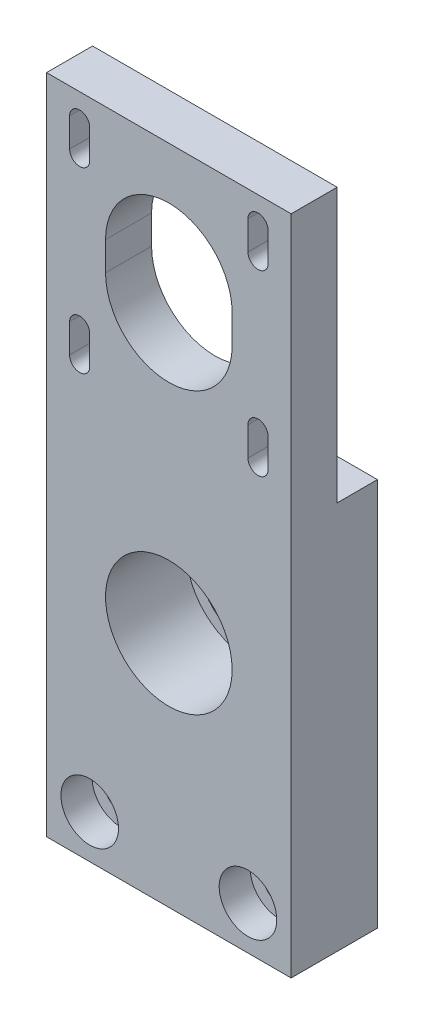
ISO-10303-21;
HEADER;
FILE_DESCRIPTION(('STEP AP214'),'2;1');
FILE_NAME('part.step','',(''),(''),'','','');
FILE_SCHEMA(('AUTOMOTIVE_DESIGN { 1 0 10303 214 1 1 1 1 }'));
ENDSEC;
DATA;
#1=APPLICATION_CONTEXT('core data for automotive mechanical design processes');
#2=APPLICATION_PROTOCOL_DEFINITION('international standard','automotive_design',2000,#1);
#3=PRODUCT_CONTEXT('',#1,'mechanical');
#4=PRODUCT('Part','Part','',(#3));
#5=PRODUCT_RELATED_PRODUCT_CATEGORY('part','',(#4));
#6=PRODUCT_DEFINITION_FORMATION('','',#4);
#7=PRODUCT_DEFINITION_CONTEXT('part definition',#1,'design');
#8=PRODUCT_DEFINITION('design','',#6,#7);
#9=PRODUCT_DEFINITION_SHAPE('','',#8);
#10=(LENGTH_UNIT() NAMED_UNIT(*) SI_UNIT(.MILLI.,.METRE.));
#11=(NAMED_UNIT(*) PLANE_ANGLE_UNIT() SI_UNIT($,.RADIAN.));
#12=(NAMED_UNIT(*) SI_UNIT($,.STERADIAN.) SOLID_ANGLE_UNIT());
#13=UNCERTAINTY_MEASURE_WITH_UNIT(LENGTH_MEASURE(1.E-05),#10,'distance_accuracy_value','');
#14=(GEOMETRIC_REPRESENTATION_CONTEXT(3) GLOBAL_UNCERTAINTY_ASSIGNED_CONTEXT((#13)) GLOBAL_UNIT_ASSIGNED_CONTEXT((#10,
#11,#12)) REPRESENTATION_CONTEXT('',''));
#15=CARTESIAN_POINT('',(0.,0.,0.));
#16=DIRECTION('',(0.,0.,1.));
#17=DIRECTION('',(1.,0.,0.));
#18=AXIS2_PLACEMENT_3D('',#15,#16,#17);
#19=CARTESIAN_POINT('',(0.,0.,15.));
#20=DIRECTION('',(0.,0.,-1.));
#21=DIRECTION('',(-1.,0.,0.));
#22=AXIS2_PLACEMENT_3D('',#19,#20,#21);
#23=PLANE('',#22);
#24=CARTESIAN_POINT('',(5.75000000000032,79.5,15.));
#25=DIRECTION('',(0.,0.,1.));
#26=DIRECTION('',(1.,0.,0.));
#27=AXIS2_PLACEMENT_3D('',#24,#25,#26);
#28=CIRCLE('',#27,1.75000000000032);
#29=CARTESIAN_POINT('',(7.50000000000032,79.5,15.));
#30=VERTEX_POINT('',#29);
#31=CARTESIAN_POINT('',(3.99999999999968,79.5,15.));
#32=VERTEX_POINT('',#31);
#33=EDGE_CURVE('E455',#30,#32,#28,.T.);
#34=ORIENTED_EDGE('',*,*,#33,.F.);
#35=DIRECTION('',(0.,1.,0.));
#36=VECTOR('',#35,1.);
#37=CARTESIAN_POINT('',(7.50000000000032,79.5,15.));
#38=LINE('',#37,#36);
#39=CARTESIAN_POINT('',(7.50000000000032,74.5,15.));
#40=VERTEX_POINT('',#39);
#41=EDGE_CURVE('E445',#40,#30,#38,.T.);
#42=ORIENTED_EDGE('',*,*,#41,.F.);
#43=CARTESIAN_POINT('',(5.75000000000032,74.5,15.));
#44=DIRECTION('',(0.,0.,1.));
#45=DIRECTION('',(1.,0.,0.));
#46=AXIS2_PLACEMENT_3D('',#43,#44,#45);
#47=CIRCLE('',#46,1.75000000000032);
#48=CARTESIAN_POINT('',(4.,74.5,15.));
#49=VERTEX_POINT('',#48);
#50=EDGE_CURVE('E448',#49,#40,#47,.T.);
#51=ORIENTED_EDGE('',*,*,#50,.F.);
#52=DIRECTION('',(0.,-1.,0.));
#53=VECTOR('',#52,1.);
#54=CARTESIAN_POINT('',(3.99999999999968,79.5,15.));
#55=LINE('',#54,#53);
#56=EDGE_CURVE('E452',#32,#49,#55,.T.);
#57=ORIENTED_EDGE('',*,*,#56,.F.);
#58=EDGE_LOOP('',(#34,#42,#51,#57));
#59=FACE_BOUND('',#58,.T.);
#60=CARTESIAN_POINT('',(36.75,110.5,15.));
#61=DIRECTION('',(0.,0.,1.));
#62=DIRECTION('',(1.,0.,0.));
#63=AXIS2_PLACEMENT_3D('',#60,#61,#62);
#64=CIRCLE('',#63,1.74999999999999);
#65=CARTESIAN_POINT('',(38.5,110.5,15.));
#66=VERTEX_POINT('',#65);
#67=CARTESIAN_POINT('',(35.,110.5,15.));
#68=VERTEX_POINT('',#67);
#69=EDGE_CURVE('E398',#66,#68,#64,.T.);
#70=ORIENTED_EDGE('',*,*,#69,.F.);
#71=DIRECTION('',(0.,1.,0.));
#72=VECTOR('',#71,1.);
#73=CARTESIAN_POINT('',(38.5,110.5,15.));
#74=LINE('',#73,#72);
#75=CARTESIAN_POINT('',(38.5,105.5,15.));
#76=VERTEX_POINT('',#75);
#77=EDGE_CURVE('E388',#76,#66,#74,.T.);
#78=ORIENTED_EDGE('',*,*,#77,.F.);
#79=CARTESIAN_POINT('',(36.75,105.5,15.));
#80=DIRECTION('',(0.,0.,1.));
#81=DIRECTION('',(1.,0.,0.));
#82=AXIS2_PLACEMENT_3D('',#79,#80,#81);
#83=CIRCLE('',#82,1.75);
#84=CARTESIAN_POINT('',(35.,105.5,15.));
#85=VERTEX_POINT('',#84);
#86=EDGE_CURVE('E391',#85,#76,#83,.T.);
#87=ORIENTED_EDGE('',*,*,#86,.F.);
#88=DIRECTION('',(0.,-1.,0.));
#89=VECTOR('',#88,1.);
#90=CARTESIAN_POINT('',(35.,110.5,15.));
#91=LINE('',#90,#89);
#92=EDGE_CURVE('E395',#68,#85,#91,.T.);
#93=ORIENTED_EDGE('',*,*,#92,.F.);
#94=EDGE_LOOP('',(#70,#78,#87,#93));
#95=FACE_BOUND('',#94,.T.);
#96=CARTESIAN_POINT('',(21.25,95.,15.));
#97=DIRECTION('',(0.,0.,1.));
#98=DIRECTION('',(1.,0.,0.));
#99=AXIS2_PLACEMENT_3D('',#96,#97,#98);
#100=CIRCLE('',#99,11.);
#101=CARTESIAN_POINT('',(32.25,95.,15.));
#102=VERTEX_POINT('',#101);
#103=CARTESIAN_POINT('',(10.25,95.,15.));
#104=VERTEX_POINT('',#103);
#105=EDGE_CURVE('E344',#102,#104,#100,.T.);
#106=ORIENTED_EDGE('',*,*,#105,.F.);
#107=DIRECTION('',(0.,1.,0.));
#108=VECTOR('',#107,1.);
#109=CARTESIAN_POINT('',(32.25,95.,15.));
#110=LINE('',#109,#108);
#111=CARTESIAN_POINT('',(32.25,90.,15.));
#112=VERTEX_POINT('',#111);
#113=EDGE_CURVE('E334',#112,#102,#110,.T.);
#114=ORIENTED_EDGE('',*,*,#113,.F.);
#115=CARTESIAN_POINT('',(21.25,90.,15.));
#116=DIRECTION('',(0.,0.,1.));
#117=DIRECTION('',(1.,0.,0.));
#118=AXIS2_PLACEMENT_3D('',#115,#116,#117);
#119=CIRCLE('',#118,11.);
#120=CARTESIAN_POINT('',(10.25,90.,15.));
#121=VERTEX_POINT('',#120);
#122=EDGE_CURVE('E337',#121,#112,#119,.T.);
#123=ORIENTED_EDGE('',*,*,#122,.F.);
#124=DIRECTION('',(0.,-1.,0.));
#125=VECTOR('',#124,1.);
#126=CARTESIAN_POINT('',(10.25,95.,15.));
#127=LINE('',#126,#125);
#128=EDGE_CURVE('E341',#104,#121,#127,.T.);
#129=ORIENTED_EDGE('',*,*,#128,.F.);
#130=EDGE_LOOP('',(#106,#114,#123,#129));
#131=FACE_BOUND('',#130,.T.);
#132=DIRECTION('',(0.,-1.,0.));
#133=VECTOR('',#132,1.);
#134=CARTESIAN_POINT('',(0.,0.,15.));
#135=LINE('',#134,#133);
#136=CARTESIAN_POINT('',(0.,115.,15.));
#137=VERTEX_POINT('',#136);
#138=CARTESIAN_POINT('',(0.,0.,15.));
#139=VERTEX_POINT('',#138);
#140=EDGE_CURVE('E291',#137,#139,#135,.T.);
#141=ORIENTED_EDGE('',*,*,#140,.T.);
#142=DIRECTION('',(1.,0.,0.));
#143=VECTOR('',#142,1.);
#144=CARTESIAN_POINT('',(0.,0.,15.));
#145=LINE('',#144,#143);
#146=CARTESIAN_POINT('',(42.5,0.,15.));
#147=VERTEX_POINT('',#146);
#148=EDGE_CURVE('E287',#139,#147,#145,.T.);
#149=ORIENTED_EDGE('',*,*,#148,.T.);
#150=DIRECTION('',(0.,1.,0.));
#151=VECTOR('',#150,1.);
#152=CARTESIAN_POINT('',(42.5,0.,15.));
#153=LINE('',#152,#151);
#154=CARTESIAN_POINT('',(42.5,115.,15.));
#155=VERTEX_POINT('',#154);
#156=EDGE_CURVE('E312',#147,#155,#153,.T.);
#157=ORIENTED_EDGE('',*,*,#156,.T.);
#158=DIRECTION('',(-1.,0.,0.));
#159=VECTOR('',#158,1.);
#160=CARTESIAN_POINT('',(0.,115.,15.));
#161=LINE('',#160,#159);
#162=EDGE_CURVE('E270',#155,#137,#161,.T.);
#163=ORIENTED_EDGE('',*,*,#162,.T.);
#164=EDGE_LOOP('',(#141,#149,#157,#163));
#165=FACE_BOUND('',#164,.T.);
#166=CARTESIAN_POINT('',(5.75,110.5,15.));
#167=DIRECTION('',(0.,0.,1.));
#168=DIRECTION('',(1.,0.,0.));
#169=AXIS2_PLACEMENT_3D('',#166,#167,#168);
#170=CIRCLE('',#169,1.75);
#171=CARTESIAN_POINT('',(7.5,110.5,15.));
#172=VERTEX_POINT('',#171);
#173=CARTESIAN_POINT('',(4.,110.5,15.));
#174=VERTEX_POINT('',#173);
#175=EDGE_CURVE('E370',#172,#174,#170,.T.);
#176=ORIENTED_EDGE('',*,*,#175,.F.);
#177=DIRECTION('',(0.,1.,0.));
#178=VECTOR('',#177,1.);
#179=CARTESIAN_POINT('',(7.5,110.5,15.));
#180=LINE('',#179,#178);
#181=CARTESIAN_POINT('',(7.5,105.5,15.));
#182=VERTEX_POINT('',#181);
#183=EDGE_CURVE('E363',#182,#172,#180,.T.);
#184=ORIENTED_EDGE('',*,*,#183,.F.);
#185=CARTESIAN_POINT('',(5.75,105.5,15.));
#186=DIRECTION('',(0.,0.,1.));
#187=DIRECTION('',(1.,0.,0.));
#188=AXIS2_PLACEMENT_3D('',#185,#186,#187);
#189=CIRCLE('',#188,1.75);
#190=CARTESIAN_POINT('',(4.,105.5,15.));
#191=VERTEX_POINT('',#190);
#192=EDGE_CURVE('E365',#191,#182,#189,.T.);
#193=ORIENTED_EDGE('',*,*,#192,.F.);
#194=DIRECTION('',(0.,-1.,0.));
#195=VECTOR('',#194,1.);
#196=CARTESIAN_POINT('',(4.,110.5,15.));
#197=LINE('',#196,#195);
#198=EDGE_CURVE('E368',#174,#191,#197,.T.);
#199=ORIENTED_EDGE('',*,*,#198,.F.);
#200=EDGE_LOOP('',(#176,#184,#193,#199));
#201=FACE_BOUND('',#200,.T.);
#202=CARTESIAN_POINT('',(36.7500000000003,79.5,15.));
#203=DIRECTION('',(0.,0.,1.));
#204=DIRECTION('',(1.,0.,0.));
#205=AXIS2_PLACEMENT_3D('',#202,#203,#204);
#206=CIRCLE('',#205,1.75000000000031);
#207=CARTESIAN_POINT('',(38.5000000000003,79.5,15.));
#208=VERTEX_POINT('',#207);
#209=CARTESIAN_POINT('',(34.9999999999997,79.5,15.));
#210=VERTEX_POINT('',#209);
#211=EDGE_CURVE('E426',#208,#210,#206,.T.);
#212=ORIENTED_EDGE('',*,*,#211,.F.);
#213=DIRECTION('',(0.,1.,0.));
#214=VECTOR('',#213,1.);
#215=CARTESIAN_POINT('',(38.5000000000003,79.5,15.));
#216=LINE('',#215,#214);
#217=CARTESIAN_POINT('',(38.5000000000003,74.5,15.));
#218=VERTEX_POINT('',#217);
#219=EDGE_CURVE('E416',#218,#208,#216,.T.);
#220=ORIENTED_EDGE('',*,*,#219,.F.);
#221=CARTESIAN_POINT('',(36.7500000000003,74.5,15.));
#222=DIRECTION('',(0.,0.,1.));
#223=DIRECTION('',(1.,0.,0.));
#224=AXIS2_PLACEMENT_3D('',#221,#222,#223);
#225=CIRCLE('',#224,1.75000000000032);
#226=CARTESIAN_POINT('',(35.,74.5,15.));
#227=VERTEX_POINT('',#226);
#228=EDGE_CURVE('E419',#227,#218,#225,.T.);
#229=ORIENTED_EDGE('',*,*,#228,.F.);
#230=DIRECTION('',(0.,-1.,0.));
#231=VECTOR('',#230,1.);
#232=CARTESIAN_POINT('',(34.9999999999997,79.5,15.));
#233=LINE('',#232,#231);
#234=EDGE_CURVE('E423',#210,#227,#233,.T.);
#235=ORIENTED_EDGE('',*,*,#234,.F.);
#236=EDGE_LOOP('',(#212,#220,#229,#235));
#237=FACE_BOUND('',#236,.T.);
#238=CARTESIAN_POINT('',(21.25,41.25,15.));
#239=DIRECTION('',(0.,0.,1.));
#240=DIRECTION('',(1.,0.,0.));
#241=AXIS2_PLACEMENT_3D('',#238,#239,#240);
#242=CIRCLE('',#241,11.);
#243=CARTESIAN_POINT('',(32.25,41.25,15.));
#244=VERTEX_POINT('',#243);
#245=EDGE_CURVE('E459',#244,#244,#242,.T.);
#246=ORIENTED_EDGE('',*,*,#245,.F.);
#247=EDGE_LOOP('',(#246));
#248=FACE_BOUND('',#247,.T.);
#249=CARTESIAN_POINT('',(7.5,7.50000000000001,15.));
#250=DIRECTION('',(0.,0.,1.));
#251=DIRECTION('',(1.,0.,0.));
#252=AXIS2_PLACEMENT_3D('',#249,#250,#251);
#253=CIRCLE('',#252,5.);
#254=CARTESIAN_POINT('',(12.5,7.50000000000001,15.));
#255=VERTEX_POINT('',#254);
#256=EDGE_CURVE('E485',#255,#255,#253,.T.);
#257=ORIENTED_EDGE('',*,*,#256,.F.);
#258=EDGE_LOOP('',(#257));
#259=FACE_BOUND('',#258,.T.);
#260=CARTESIAN_POINT('',(35.,7.5,15.));
#261=DIRECTION('',(0.,0.,1.));
#262=DIRECTION('',(1.,0.,0.));
#263=AXIS2_PLACEMENT_3D('',#260,#261,#262);
#264=CIRCLE('',#263,5.);
#265=CARTESIAN_POINT('',(40.,7.5,15.));
#266=VERTEX_POINT('',#265);
#267=EDGE_CURVE('E499',#266,#266,#264,.T.);
#268=ORIENTED_EDGE('',*,*,#267,.F.);
#269=EDGE_LOOP('',(#268));
#270=FACE_BOUND('',#269,.T.);
#271=ADVANCED_FACE('F41',(#59,#95,#131,#165,#201,#237,#248,#259,#270),#23,.F.);
#272=CARTESIAN_POINT('',(0.,0.,0.));
#273=DIRECTION('',(0.,0.,-1.));
#274=DIRECTION('',(-1.,0.,0.));
#275=AXIS2_PLACEMENT_3D('',#272,#273,#274);
#276=PLANE('',#275);
#277=DIRECTION('',(1.,0.,0.));
#278=VECTOR('',#277,1.);
#279=CARTESIAN_POINT('',(-7.5,67.5,0.));
#280=LINE('',#279,#278);
#281=CARTESIAN_POINT('',(0.,67.5,0.));
#282=VERTEX_POINT('',#281);
#283=CARTESIAN_POINT('',(42.5,67.5,0.));
#284=VERTEX_POINT('',#283);
#285=EDGE_CURVE('E561',#282,#284,#280,.T.);
#286=ORIENTED_EDGE('',*,*,#285,.T.);
#287=DIRECTION('',(0.,1.,0.));
#288=VECTOR('',#287,1.);
#289=CARTESIAN_POINT('',(42.5,0.,0.));
#290=LINE('',#289,#288);
#291=CARTESIAN_POINT('',(42.5,0.,0.));
#292=VERTEX_POINT('',#291);
#293=EDGE_CURVE('E304',#292,#284,#290,.T.);
#294=ORIENTED_EDGE('',*,*,#293,.F.);
#295=DIRECTION('',(1.,0.,0.));
#296=VECTOR('',#295,1.);
#297=CARTESIAN_POINT('',(0.,0.,0.));
#298=LINE('',#297,#296);
#299=CARTESIAN_POINT('',(0.,0.,0.));
#300=VERTEX_POINT('',#299);
#301=EDGE_CURVE('E286',#300,#292,#298,.T.);
#302=ORIENTED_EDGE('',*,*,#301,.F.);
#303=DIRECTION('',(0.,-1.,0.));
#304=VECTOR('',#303,1.);
#305=CARTESIAN_POINT('',(0.,0.,0.));
#306=LINE('',#305,#304);
#307=EDGE_CURVE('E294',#282,#300,#306,.T.);
#308=ORIENTED_EDGE('',*,*,#307,.F.);
#309=EDGE_LOOP('',(#286,#294,#302,#308));
#310=FACE_BOUND('',#309,.T.);
#311=CARTESIAN_POINT('',(35.,7.5,0.));
#312=DIRECTION('',(0.,0.,1.));
#313=DIRECTION('',(1.,0.,0.));
#314=AXIS2_PLACEMENT_3D('',#311,#312,#313);
#315=CIRCLE('',#314,2.75);
#316=CARTESIAN_POINT('',(37.75,7.5,0.));
#317=VERTEX_POINT('',#316);
#318=EDGE_CURVE('E489',#317,#317,#315,.T.);
#319=ORIENTED_EDGE('',*,*,#318,.T.);
#320=EDGE_LOOP('',(#319));
#321=FACE_BOUND('',#320,.T.);
#322=CARTESIAN_POINT('',(7.5,7.50000000000001,0.));
#323=DIRECTION('',(0.,0.,1.));
#324=DIRECTION('',(1.,0.,0.));
#325=AXIS2_PLACEMENT_3D('',#322,#323,#324);
#326=CIRCLE('',#325,2.75);
#327=CARTESIAN_POINT('',(10.25,7.50000000000001,0.));
#328=VERTEX_POINT('',#327);
#329=EDGE_CURVE('E474',#328,#328,#326,.T.);
#330=ORIENTED_EDGE('',*,*,#329,.T.);
#331=EDGE_LOOP('',(#330));
#332=FACE_BOUND('',#331,.T.);
#333=CARTESIAN_POINT('',(21.25,41.25,0.));
#334=DIRECTION('',(0.,0.,-1.));
#335=DIRECTION('',(-1.,0.,0.));
#336=AXIS2_PLACEMENT_3D('',#333,#334,#335);
#337=CIRCLE('',#336,9.);
#338=CARTESIAN_POINT('',(12.25,41.25,0.));
#339=VERTEX_POINT('',#338);
#340=EDGE_CURVE('E463',#339,#339,#337,.T.);
#341=ORIENTED_EDGE('',*,*,#340,.F.);
#342=EDGE_LOOP('',(#341));
#343=FACE_BOUND('',#342,.T.);
#344=ADVANCED_FACE('F302',(#310,#321,#332,#343),#276,.T.);
#345=CARTESIAN_POINT('',(0.,0.,15.));
#346=DIRECTION('',(1.,0.,0.));
#347=DIRECTION('',(0.,0.,-1.));
#348=AXIS2_PLACEMENT_3D('',#345,#346,#347);
#349=PLANE('',#348);
#350=DIRECTION('',(0.,-1.,0.));
#351=VECTOR('',#350,1.);
#352=CARTESIAN_POINT('',(0.,0.,7.));
#353=LINE('',#352,#351);
#354=CARTESIAN_POINT('',(0.,115.,7.));
#355=VERTEX_POINT('',#354);
#356=CARTESIAN_POINT('',(0.,67.5,7.));
#357=VERTEX_POINT('',#356);
#358=EDGE_CURVE('E60',#355,#357,#353,.T.);
#359=ORIENTED_EDGE('',*,*,#358,.T.);
#360=DIRECTION('',(0.,0.,-1.));
#361=VECTOR('',#360,1.);
#362=CARTESIAN_POINT('',(0.,67.5,15.));
#363=LINE('',#362,#361);
#364=EDGE_CURVE('E295',#357,#282,#363,.T.);
#365=ORIENTED_EDGE('',*,*,#364,.T.);
#366=ORIENTED_EDGE('',*,*,#307,.T.);
#367=DIRECTION('',(0.,0.,-1.));
#368=VECTOR('',#367,1.);
#369=CARTESIAN_POINT('',(0.,0.,15.));
#370=LINE('',#369,#368);
#371=EDGE_CURVE('E50',#139,#300,#370,.T.);
#372=ORIENTED_EDGE('',*,*,#371,.F.);
#373=ORIENTED_EDGE('',*,*,#140,.F.);
#374=DIRECTION('',(0.,0.,-1.));
#375=VECTOR('',#374,1.);
#376=CARTESIAN_POINT('',(0.,115.,15.));
#377=LINE('',#376,#375);
#378=EDGE_CURVE('E272',#137,#355,#377,.T.);
#379=ORIENTED_EDGE('',*,*,#378,.T.);
#380=EDGE_LOOP('',(#359,#365,#366,#372,#373,#379));
#381=FACE_BOUND('',#380,.T.);
#382=ADVANCED_FACE('F43',(#381),#349,.F.);
#383=CARTESIAN_POINT('',(0.,0.,15.));
#384=DIRECTION('',(0.,1.,0.));
#385=DIRECTION('',(0.,0.,1.));
#386=AXIS2_PLACEMENT_3D('',#383,#384,#385);
#387=PLANE('',#386);
#388=ORIENTED_EDGE('',*,*,#301,.T.);
#389=DIRECTION('',(0.,0.,-1.));
#390=VECTOR('',#389,1.);
#391=CARTESIAN_POINT('',(42.5,0.,15.));
#392=LINE('',#391,#390);
#393=EDGE_CURVE('E271',#147,#292,#392,.T.);
#394=ORIENTED_EDGE('',*,*,#393,.F.);
#395=ORIENTED_EDGE('',*,*,#148,.F.);
#396=ORIENTED_EDGE('',*,*,#371,.T.);
#397=EDGE_LOOP('',(#388,#394,#395,#396));
#398=FACE_BOUND('',#397,.T.);
#399=ADVANCED_FACE('F283',(#398),#387,.F.);
#400=CARTESIAN_POINT('',(42.5,0.,15.));
#401=DIRECTION('',(-1.,0.,0.));
#402=DIRECTION('',(0.,0.,1.));
#403=AXIS2_PLACEMENT_3D('',#400,#401,#402);
#404=PLANE('',#403);
#405=ORIENTED_EDGE('',*,*,#293,.T.);
#406=DIRECTION('',(0.,0.,-1.));
#407=VECTOR('',#406,1.);
#408=CARTESIAN_POINT('',(42.5,67.5,0.));
#409=LINE('',#408,#407);
#410=CARTESIAN_POINT('',(42.5,67.5,7.));
#411=VERTEX_POINT('',#410);
#412=EDGE_CURVE('E258',#411,#284,#409,.T.);
#413=ORIENTED_EDGE('',*,*,#412,.F.);
#414=DIRECTION('',(0.,-1.,0.));
#415=VECTOR('',#414,1.);
#416=CARTESIAN_POINT('',(42.5,67.5,7.));
#417=LINE('',#416,#415);
#418=CARTESIAN_POINT('',(42.5,115.,7.));
#419=VERTEX_POINT('',#418);
#420=EDGE_CURVE('E250',#419,#411,#417,.T.);
#421=ORIENTED_EDGE('',*,*,#420,.F.);
#422=DIRECTION('',(0.,0.,-1.));
#423=VECTOR('',#422,1.);
#424=CARTESIAN_POINT('',(42.5,115.,15.));
#425=LINE('',#424,#423);
#426=EDGE_CURVE('E265',#155,#419,#425,.T.);
#427=ORIENTED_EDGE('',*,*,#426,.F.);
#428=ORIENTED_EDGE('',*,*,#156,.F.);
#429=ORIENTED_EDGE('',*,*,#393,.T.);
#430=EDGE_LOOP('',(#405,#413,#421,#427,#428,#429));
#431=FACE_BOUND('',#430,.T.);
#432=ADVANCED_FACE('F263',(#431),#404,.F.);
#433=CARTESIAN_POINT('',(0.,115.,15.));
#434=DIRECTION('',(0.,-1.,0.));
#435=DIRECTION('',(0.,0.,-1.));
#436=AXIS2_PLACEMENT_3D('',#433,#434,#435);
#437=PLANE('',#436);
#438=ORIENTED_EDGE('',*,*,#426,.T.);
#439=DIRECTION('',(1.,0.,0.));
#440=VECTOR('',#439,1.);
#441=CARTESIAN_POINT('',(-7.5,115.,7.));
#442=LINE('',#441,#440);
#443=EDGE_CURVE('E247',#355,#419,#442,.T.);
#444=ORIENTED_EDGE('',*,*,#443,.F.);
#445=ORIENTED_EDGE('',*,*,#378,.F.);
#446=ORIENTED_EDGE('',*,*,#162,.F.);
#447=EDGE_LOOP('',(#438,#444,#445,#446));
#448=FACE_BOUND('',#447,.T.);
#449=ADVANCED_FACE('F269',(#448),#437,.F.);
#450=CARTESIAN_POINT('',(21.25,95.,15.));
#451=DIRECTION('',(0.,0.,-1.));
#452=DIRECTION('',(-1.,0.,0.));
#453=AXIS2_PLACEMENT_3D('',#450,#451,#452);
#454=CYLINDRICAL_SURFACE('',#453,11.);
#455=CARTESIAN_POINT('',(21.25,95.,7.));
#456=DIRECTION('',(0.,0.,1.));
#457=DIRECTION('',(1.,0.,0.));
#458=AXIS2_PLACEMENT_3D('',#455,#456,#457);
#459=CIRCLE('',#458,11.);
#460=CARTESIAN_POINT('',(32.25,95.,7.));
#461=VERTEX_POINT('',#460);
#462=CARTESIAN_POINT('',(10.25,95.,7.));
#463=VERTEX_POINT('',#462);
#464=EDGE_CURVE('E507',#461,#463,#459,.T.);
#465=ORIENTED_EDGE('',*,*,#464,.F.);
#466=DIRECTION('',(0.,0.,-1.));
#467=VECTOR('',#466,1.);
#468=CARTESIAN_POINT('',(32.25,95.,15.));
#469=LINE('',#468,#467);
#470=EDGE_CURVE('E330',#102,#461,#469,.T.);
#471=ORIENTED_EDGE('',*,*,#470,.F.);
#472=ORIENTED_EDGE('',*,*,#105,.T.);
#473=DIRECTION('',(0.,0.,-1.));
#474=VECTOR('',#473,1.);
#475=CARTESIAN_POINT('',(10.25,95.,15.));
#476=LINE('',#475,#474);
#477=EDGE_CURVE('E299',#104,#463,#476,.T.);
#478=ORIENTED_EDGE('',*,*,#477,.T.);
#479=EDGE_LOOP('',(#465,#471,#472,#478));
#480=FACE_BOUND('',#479,.T.);
#481=ADVANCED_FACE('F707',(#480),#454,.F.);
#482=CARTESIAN_POINT('',(10.25,95.,15.));
#483=DIRECTION('',(1.,0.,0.));
#484=DIRECTION('',(0.,0.,-1.));
#485=AXIS2_PLACEMENT_3D('',#482,#483,#484);
#486=PLANE('',#485);
#487=DIRECTION('',(0.,-1.,0.));
#488=VECTOR('',#487,1.);
#489=CARTESIAN_POINT('',(10.25,95.,7.));
#490=LINE('',#489,#488);
#491=CARTESIAN_POINT('',(10.25,90.,7.));
#492=VERTEX_POINT('',#491);
#493=EDGE_CURVE('E510',#463,#492,#490,.T.);
#494=ORIENTED_EDGE('',*,*,#493,.F.);
#495=ORIENTED_EDGE('',*,*,#477,.F.);
#496=ORIENTED_EDGE('',*,*,#128,.T.);
#497=DIRECTION('',(0.,0.,-1.));
#498=VECTOR('',#497,1.);
#499=CARTESIAN_POINT('',(10.25,90.,15.));
#500=LINE('',#499,#498);
#501=EDGE_CURVE('E322',#121,#492,#500,.T.);
#502=ORIENTED_EDGE('',*,*,#501,.T.);
#503=EDGE_LOOP('',(#494,#495,#496,#502));
#504=FACE_BOUND('',#503,.T.);
#505=ADVANCED_FACE('F703',(#504),#486,.T.);
#506=CARTESIAN_POINT('',(21.25,90.,15.));
#507=DIRECTION('',(0.,0.,-1.));
#508=DIRECTION('',(-1.,0.,0.));
#509=AXIS2_PLACEMENT_3D('',#506,#507,#508);
#510=CYLINDRICAL_SURFACE('',#509,11.);
#511=CARTESIAN_POINT('',(21.25,90.,7.));
#512=DIRECTION('',(0.,0.,1.));
#513=DIRECTION('',(1.,0.,0.));
#514=AXIS2_PLACEMENT_3D('',#511,#512,#513);
#515=CIRCLE('',#514,11.);
#516=CARTESIAN_POINT('',(32.25,90.,7.));
#517=VERTEX_POINT('',#516);
#518=EDGE_CURVE('E71',#492,#517,#515,.T.);
#519=ORIENTED_EDGE('',*,*,#518,.F.);
#520=ORIENTED_EDGE('',*,*,#501,.F.);
#521=ORIENTED_EDGE('',*,*,#122,.T.);
#522=DIRECTION('',(0.,0.,-1.));
#523=VECTOR('',#522,1.);
#524=CARTESIAN_POINT('',(32.25,90.,15.));
#525=LINE('',#524,#523);
#526=EDGE_CURVE('E326',#112,#517,#525,.T.);
#527=ORIENTED_EDGE('',*,*,#526,.T.);
#528=EDGE_LOOP('',(#519,#520,#521,#527));
#529=FACE_BOUND('',#528,.T.);
#530=ADVANCED_FACE('F699',(#529),#510,.F.);
#531=CARTESIAN_POINT('',(32.25,95.,15.));
#532=DIRECTION('',(-1.,0.,0.));
#533=DIRECTION('',(0.,0.,1.));
#534=AXIS2_PLACEMENT_3D('',#531,#532,#533);
#535=PLANE('',#534);
#536=DIRECTION('',(0.,1.,0.));
#537=VECTOR('',#536,1.);
#538=CARTESIAN_POINT('',(32.25,95.,7.));
#539=LINE('',#538,#537);
#540=EDGE_CURVE('E515',#517,#461,#539,.T.);
#541=ORIENTED_EDGE('',*,*,#540,.F.);
#542=ORIENTED_EDGE('',*,*,#526,.F.);
#543=ORIENTED_EDGE('',*,*,#113,.T.);
#544=ORIENTED_EDGE('',*,*,#470,.T.);
#545=EDGE_LOOP('',(#541,#542,#543,#544));
#546=FACE_BOUND('',#545,.T.);
#547=ADVANCED_FACE('F695',(#546),#535,.T.);
#548=CARTESIAN_POINT('',(5.75,110.5,15.));
#549=DIRECTION('',(0.,0.,-1.));
#550=DIRECTION('',(-1.,0.,0.));
#551=AXIS2_PLACEMENT_3D('',#548,#549,#550);
#552=CYLINDRICAL_SURFACE('',#551,1.75);
#553=CARTESIAN_POINT('',(5.75,110.5,7.));
#554=DIRECTION('',(0.,0.,1.));
#555=DIRECTION('',(1.,0.,0.));
#556=AXIS2_PLACEMENT_3D('',#553,#554,#555);
#557=CIRCLE('',#556,1.75);
#558=CARTESIAN_POINT('',(7.5,110.5,7.));
#559=VERTEX_POINT('',#558);
#560=CARTESIAN_POINT('',(4.,110.5,7.));
#561=VERTEX_POINT('',#560);
#562=EDGE_CURVE('E518',#559,#561,#557,.T.);
#563=ORIENTED_EDGE('',*,*,#562,.F.);
#564=DIRECTION('',(0.,0.,-1.));
#565=VECTOR('',#564,1.);
#566=CARTESIAN_POINT('',(7.5,110.5,15.));
#567=LINE('',#566,#565);
#568=EDGE_CURVE('E359',#172,#559,#567,.T.);
#569=ORIENTED_EDGE('',*,*,#568,.F.);
#570=ORIENTED_EDGE('',*,*,#175,.T.);
#571=DIRECTION('',(0.,0.,-1.));
#572=VECTOR('',#571,1.);
#573=CARTESIAN_POINT('',(4.,110.5,15.));
#574=LINE('',#573,#572);
#575=EDGE_CURVE('E347',#174,#561,#574,.T.);
#576=ORIENTED_EDGE('',*,*,#575,.T.);
#577=EDGE_LOOP('',(#563,#569,#570,#576));
#578=FACE_BOUND('',#577,.T.);
#579=ADVANCED_FACE('F691',(#578),#552,.F.);
#580=CARTESIAN_POINT('',(4.,110.5,15.));
#581=DIRECTION('',(1.,0.,0.));
#582=DIRECTION('',(0.,0.,-1.));
#583=AXIS2_PLACEMENT_3D('',#580,#581,#582);
#584=PLANE('',#583);
#585=DIRECTION('',(0.,-1.,0.));
#586=VECTOR('',#585,1.);
#587=CARTESIAN_POINT('',(4.,110.5,7.));
#588=LINE('',#587,#586);
#589=CARTESIAN_POINT('',(4.,105.5,7.));
#590=VERTEX_POINT('',#589);
#591=EDGE_CURVE('E521',#561,#590,#588,.T.);
#592=ORIENTED_EDGE('',*,*,#591,.F.);
#593=ORIENTED_EDGE('',*,*,#575,.F.);
#594=ORIENTED_EDGE('',*,*,#198,.T.);
#595=DIRECTION('',(0.,0.,-1.));
#596=VECTOR('',#595,1.);
#597=CARTESIAN_POINT('',(4.,105.5,15.));
#598=LINE('',#597,#596);
#599=EDGE_CURVE('E351',#191,#590,#598,.T.);
#600=ORIENTED_EDGE('',*,*,#599,.T.);
#601=EDGE_LOOP('',(#592,#593,#594,#600));
#602=FACE_BOUND('',#601,.T.);
#603=ADVANCED_FACE('F687',(#602),#584,.T.);
#604=CARTESIAN_POINT('',(5.75,105.5,15.));
#605=DIRECTION('',(0.,0.,-1.));
#606=DIRECTION('',(-1.,0.,0.));
#607=AXIS2_PLACEMENT_3D('',#604,#605,#606);
#608=CYLINDRICAL_SURFACE('',#607,1.75);
#609=CARTESIAN_POINT('',(5.75,105.5,7.));
#610=DIRECTION('',(0.,0.,1.));
#611=DIRECTION('',(1.,0.,0.));
#612=AXIS2_PLACEMENT_3D('',#609,#610,#611);
#613=CIRCLE('',#612,1.75);
#614=CARTESIAN_POINT('',(7.5,105.5,7.));
#615=VERTEX_POINT('',#614);
#616=EDGE_CURVE('E524',#590,#615,#613,.T.);
#617=ORIENTED_EDGE('',*,*,#616,.F.);
#618=ORIENTED_EDGE('',*,*,#599,.F.);
#619=ORIENTED_EDGE('',*,*,#192,.T.);
#620=DIRECTION('',(0.,0.,-1.));
#621=VECTOR('',#620,1.);
#622=CARTESIAN_POINT('',(7.5,105.5,15.));
#623=LINE('',#622,#621);
#624=EDGE_CURVE('E355',#182,#615,#623,.T.);
#625=ORIENTED_EDGE('',*,*,#624,.T.);
#626=EDGE_LOOP('',(#617,#618,#619,#625));
#627=FACE_BOUND('',#626,.T.);
#628=ADVANCED_FACE('F683',(#627),#608,.F.);
#629=CARTESIAN_POINT('',(7.5,110.5,15.));
#630=DIRECTION('',(-1.,0.,0.));
#631=DIRECTION('',(0.,0.,1.));
#632=AXIS2_PLACEMENT_3D('',#629,#630,#631);
#633=PLANE('',#632);
#634=DIRECTION('',(0.,1.,0.));
#635=VECTOR('',#634,1.);
#636=CARTESIAN_POINT('',(7.5,110.5,7.));
#637=LINE('',#636,#635);
#638=EDGE_CURVE('E527',#615,#559,#637,.T.);
#639=ORIENTED_EDGE('',*,*,#638,.F.);
#640=ORIENTED_EDGE('',*,*,#624,.F.);
#641=ORIENTED_EDGE('',*,*,#183,.T.);
#642=ORIENTED_EDGE('',*,*,#568,.T.);
#643=EDGE_LOOP('',(#639,#640,#641,#642));
#644=FACE_BOUND('',#643,.T.);
#645=ADVANCED_FACE('F679',(#644),#633,.T.);
#646=CARTESIAN_POINT('',(36.75,110.5,15.));
#647=DIRECTION('',(0.,0.,-1.));
#648=DIRECTION('',(-1.,0.,0.));
#649=AXIS2_PLACEMENT_3D('',#646,#647,#648);
#650=CYLINDRICAL_SURFACE('',#649,1.74999999999999);
#651=CARTESIAN_POINT('',(36.75,110.5,7.));
#652=DIRECTION('',(0.,0.,1.));
#653=DIRECTION('',(1.,0.,0.));
#654=AXIS2_PLACEMENT_3D('',#651,#652,#653);
#655=CIRCLE('',#654,1.74999999999999);
#656=CARTESIAN_POINT('',(38.5,110.5,7.));
#657=VERTEX_POINT('',#656);
#658=CARTESIAN_POINT('',(35.,110.5,7.));
#659=VERTEX_POINT('',#658);
#660=EDGE_CURVE('E530',#657,#659,#655,.T.);
#661=ORIENTED_EDGE('',*,*,#660,.F.);
#662=DIRECTION('',(0.,0.,-1.));
#663=VECTOR('',#662,1.);
#664=CARTESIAN_POINT('',(38.5,110.5,15.));
#665=LINE('',#664,#663);
#666=EDGE_CURVE('E384',#66,#657,#665,.T.);
#667=ORIENTED_EDGE('',*,*,#666,.F.);
#668=ORIENTED_EDGE('',*,*,#69,.T.);
#669=DIRECTION('',(0.,0.,-1.));
#670=VECTOR('',#669,1.);
#671=CARTESIAN_POINT('',(35.,110.5,15.));
#672=LINE('',#671,#670);
#673=EDGE_CURVE('E372',#68,#659,#672,.T.);
#674=ORIENTED_EDGE('',*,*,#673,.T.);
#675=EDGE_LOOP('',(#661,#667,#668,#674));
#676=FACE_BOUND('',#675,.T.);
#677=ADVANCED_FACE('F675',(#676),#650,.F.);
#678=CARTESIAN_POINT('',(35.,110.5,15.));
#679=DIRECTION('',(1.,0.,0.));
#680=DIRECTION('',(0.,1.,0.));
#681=AXIS2_PLACEMENT_3D('',#678,#679,#680);
#682=PLANE('',#681);
#683=DIRECTION('',(0.,-1.,0.));
#684=VECTOR('',#683,1.);
#685=CARTESIAN_POINT('',(35.,110.5,7.));
#686=LINE('',#685,#684);
#687=CARTESIAN_POINT('',(35.,105.5,7.));
#688=VERTEX_POINT('',#687);
#689=EDGE_CURVE('E533',#659,#688,#686,.T.);
#690=ORIENTED_EDGE('',*,*,#689,.F.);
#691=ORIENTED_EDGE('',*,*,#673,.F.);
#692=ORIENTED_EDGE('',*,*,#92,.T.);
#693=DIRECTION('',(0.,0.,-1.));
#694=VECTOR('',#693,1.);
#695=CARTESIAN_POINT('',(35.,105.5,15.));
#696=LINE('',#695,#694);
#697=EDGE_CURVE('E376',#85,#688,#696,.T.);
#698=ORIENTED_EDGE('',*,*,#697,.T.);
#699=EDGE_LOOP('',(#690,#691,#692,#698));
#700=FACE_BOUND('',#699,.T.);
#701=ADVANCED_FACE('F671',(#700),#682,.T.);
#702=CARTESIAN_POINT('',(36.75,105.5,15.));
#703=DIRECTION('',(0.,0.,-1.));
#704=DIRECTION('',(-1.,0.,0.));
#705=AXIS2_PLACEMENT_3D('',#702,#703,#704);
#706=CYLINDRICAL_SURFACE('',#705,1.75);
#707=CARTESIAN_POINT('',(36.75,105.5,7.));
#708=DIRECTION('',(0.,0.,1.));
#709=DIRECTION('',(1.,0.,0.));
#710=AXIS2_PLACEMENT_3D('',#707,#708,#709);
#711=CIRCLE('',#710,1.75);
#712=CARTESIAN_POINT('',(38.5,105.5,7.));
#713=VERTEX_POINT('',#712);
#714=EDGE_CURVE('E536',#688,#713,#711,.T.);
#715=ORIENTED_EDGE('',*,*,#714,.F.);
#716=ORIENTED_EDGE('',*,*,#697,.F.);
#717=ORIENTED_EDGE('',*,*,#86,.T.);
#718=DIRECTION('',(0.,0.,-1.));
#719=VECTOR('',#718,1.);
#720=CARTESIAN_POINT('',(38.5,105.5,15.));
#721=LINE('',#720,#719);
#722=EDGE_CURVE('E380',#76,#713,#721,.T.);
#723=ORIENTED_EDGE('',*,*,#722,.T.);
#724=EDGE_LOOP('',(#715,#716,#717,#723));
#725=FACE_BOUND('',#724,.T.);
#726=ADVANCED_FACE('F667',(#725),#706,.F.);
#727=CARTESIAN_POINT('',(38.5,110.5,15.));
#728=DIRECTION('',(-1.,0.,0.));
#729=DIRECTION('',(0.,-1.,0.));
#730=AXIS2_PLACEMENT_3D('',#727,#728,#729);
#731=PLANE('',#730);
#732=DIRECTION('',(0.,1.,0.));
#733=VECTOR('',#732,1.);
#734=CARTESIAN_POINT('',(38.5,110.5,7.));
#735=LINE('',#734,#733);
#736=EDGE_CURVE('E539',#713,#657,#735,.T.);
#737=ORIENTED_EDGE('',*,*,#736,.F.);
#738=ORIENTED_EDGE('',*,*,#722,.F.);
#739=ORIENTED_EDGE('',*,*,#77,.T.);
#740=ORIENTED_EDGE('',*,*,#666,.T.);
#741=EDGE_LOOP('',(#737,#738,#739,#740));
#742=FACE_BOUND('',#741,.T.);
#743=ADVANCED_FACE('F663',(#742),#731,.T.);
#744=CARTESIAN_POINT('',(36.7500000000003,79.5,15.));
#745=DIRECTION('',(0.,0.,-1.));
#746=DIRECTION('',(-1.,0.,0.));
#747=AXIS2_PLACEMENT_3D('',#744,#745,#746);
#748=CYLINDRICAL_SURFACE('',#747,1.75000000000031);
#749=CARTESIAN_POINT('',(36.7500000000003,79.5,7.));
#750=DIRECTION('',(0.,0.,1.));
#751=DIRECTION('',(1.,0.,0.));
#752=AXIS2_PLACEMENT_3D('',#749,#750,#751);
#753=CIRCLE('',#752,1.75000000000031);
#754=CARTESIAN_POINT('',(38.5000000000003,79.5,7.));
#755=VERTEX_POINT('',#754);
#756=CARTESIAN_POINT('',(34.9999999999997,79.5,7.));
#757=VERTEX_POINT('',#756);
#758=EDGE_CURVE('E542',#755,#757,#753,.T.);
#759=ORIENTED_EDGE('',*,*,#758,.F.);
#760=DIRECTION('',(0.,0.,-1.));
#761=VECTOR('',#760,1.);
#762=CARTESIAN_POINT('',(38.5000000000003,79.5,15.));
#763=LINE('',#762,#761);
#764=EDGE_CURVE('E412',#208,#755,#763,.T.);
#765=ORIENTED_EDGE('',*,*,#764,.F.);
#766=ORIENTED_EDGE('',*,*,#211,.T.);
#767=DIRECTION('',(0.,0.,-1.));
#768=VECTOR('',#767,1.);
#769=CARTESIAN_POINT('',(34.9999999999997,79.5,15.));
#770=LINE('',#769,#768);
#771=EDGE_CURVE('E400',#210,#757,#770,.T.);
#772=ORIENTED_EDGE('',*,*,#771,.T.);
#773=EDGE_LOOP('',(#759,#765,#766,#772));
#774=FACE_BOUND('',#773,.T.);
#775=ADVANCED_FACE('F659',(#774),#748,.F.);
#776=CARTESIAN_POINT('',(34.9999999999997,79.5,15.));
#777=DIRECTION('',(1.,0.,0.));
#778=DIRECTION('',(0.,0.,-1.));
#779=AXIS2_PLACEMENT_3D('',#776,#777,#778);
#780=PLANE('',#779);
#781=DIRECTION('',(0.,-1.,0.));
#782=VECTOR('',#781,1.);
#783=CARTESIAN_POINT('',(34.9999999999997,79.5,7.));
#784=LINE('',#783,#782);
#785=CARTESIAN_POINT('',(35.,74.5,7.));
#786=VERTEX_POINT('',#785);
#787=EDGE_CURVE('E545',#757,#786,#784,.T.);
#788=ORIENTED_EDGE('',*,*,#787,.F.);
#789=ORIENTED_EDGE('',*,*,#771,.F.);
#790=ORIENTED_EDGE('',*,*,#234,.T.);
#791=DIRECTION('',(0.,0.,-1.));
#792=VECTOR('',#791,1.);
#793=CARTESIAN_POINT('',(35.,74.5,15.));
#794=LINE('',#793,#792);
#795=EDGE_CURVE('E404',#227,#786,#794,.T.);
#796=ORIENTED_EDGE('',*,*,#795,.T.);
#797=EDGE_LOOP('',(#788,#789,#790,#796));
#798=FACE_BOUND('',#797,.T.);
#799=ADVANCED_FACE('F655',(#798),#780,.T.);
#800=CARTESIAN_POINT('',(36.7500000000003,74.5,15.));
#801=DIRECTION('',(0.,0.,-1.));
#802=DIRECTION('',(-1.,0.,0.));
#803=AXIS2_PLACEMENT_3D('',#800,#801,#802);
#804=CYLINDRICAL_SURFACE('',#803,1.75000000000032);
#805=CARTESIAN_POINT('',(36.7500000000003,74.5,7.));
#806=DIRECTION('',(0.,0.,1.));
#807=DIRECTION('',(1.,0.,0.));
#808=AXIS2_PLACEMENT_3D('',#805,#806,#807);
#809=CIRCLE('',#808,1.75000000000032);
#810=CARTESIAN_POINT('',(38.5000000000003,74.5,7.));
#811=VERTEX_POINT('',#810);
#812=EDGE_CURVE('E548',#786,#811,#809,.T.);
#813=ORIENTED_EDGE('',*,*,#812,.F.);
#814=ORIENTED_EDGE('',*,*,#795,.F.);
#815=ORIENTED_EDGE('',*,*,#228,.T.);
#816=DIRECTION('',(0.,0.,-1.));
#817=VECTOR('',#816,1.);
#818=CARTESIAN_POINT('',(38.5000000000003,74.5,15.));
#819=LINE('',#818,#817);
#820=EDGE_CURVE('E408',#218,#811,#819,.T.);
#821=ORIENTED_EDGE('',*,*,#820,.T.);
#822=EDGE_LOOP('',(#813,#814,#815,#821));
#823=FACE_BOUND('',#822,.T.);
#824=ADVANCED_FACE('F651',(#823),#804,.F.);
#825=CARTESIAN_POINT('',(38.5000000000003,79.5,15.));
#826=DIRECTION('',(-1.,0.,0.));
#827=DIRECTION('',(0.,-1.,0.));
#828=AXIS2_PLACEMENT_3D('',#825,#826,#827);
#829=PLANE('',#828);
#830=DIRECTION('',(0.,1.,0.));
#831=VECTOR('',#830,1.);
#832=CARTESIAN_POINT('',(38.5000000000003,79.5,7.));
#833=LINE('',#832,#831);
#834=EDGE_CURVE('E551',#811,#755,#833,.T.);
#835=ORIENTED_EDGE('',*,*,#834,.F.);
#836=ORIENTED_EDGE('',*,*,#820,.F.);
#837=ORIENTED_EDGE('',*,*,#219,.T.);
#838=ORIENTED_EDGE('',*,*,#764,.T.);
#839=EDGE_LOOP('',(#835,#836,#837,#838));
#840=FACE_BOUND('',#839,.T.);
#841=ADVANCED_FACE('F647',(#840),#829,.T.);
#842=CARTESIAN_POINT('',(5.75000000000032,79.5,15.));
#843=DIRECTION('',(0.,0.,-1.));
#844=DIRECTION('',(-1.,0.,0.));
#845=AXIS2_PLACEMENT_3D('',#842,#843,#844);
#846=CYLINDRICAL_SURFACE('',#845,1.75000000000032);
#847=CARTESIAN_POINT('',(5.75000000000032,79.5,7.));
#848=DIRECTION('',(0.,0.,1.));
#849=DIRECTION('',(1.,0.,0.));
#850=AXIS2_PLACEMENT_3D('',#847,#848,#849);
#851=CIRCLE('',#850,1.75000000000032);
#852=CARTESIAN_POINT('',(7.50000000000032,79.5,7.));
#853=VERTEX_POINT('',#852);
#854=CARTESIAN_POINT('',(3.99999999999968,79.5,7.));
#855=VERTEX_POINT('',#854);
#856=EDGE_CURVE('E553',#853,#855,#851,.T.);
#857=ORIENTED_EDGE('',*,*,#856,.F.);
#858=DIRECTION('',(0.,0.,-1.));
#859=VECTOR('',#858,1.);
#860=CARTESIAN_POINT('',(7.50000000000032,79.5,15.));
#861=LINE('',#860,#859);
#862=EDGE_CURVE('E441',#30,#853,#861,.T.);
#863=ORIENTED_EDGE('',*,*,#862,.F.);
#864=ORIENTED_EDGE('',*,*,#33,.T.);
#865=DIRECTION('',(0.,0.,-1.));
#866=VECTOR('',#865,1.);
#867=CARTESIAN_POINT('',(3.99999999999968,79.5,15.));
#868=LINE('',#867,#866);
#869=EDGE_CURVE('E429',#32,#855,#868,.T.);
#870=ORIENTED_EDGE('',*,*,#869,.T.);
#871=EDGE_LOOP('',(#857,#863,#864,#870));
#872=FACE_BOUND('',#871,.T.);
#873=ADVANCED_FACE('F643',(#872),#846,.F.);
#874=CARTESIAN_POINT('',(3.99999999999968,79.5,15.));
#875=DIRECTION('',(1.,0.,0.));
#876=DIRECTION('',(0.,1.,0.));
#877=AXIS2_PLACEMENT_3D('',#874,#875,#876);
#878=PLANE('',#877);
#879=DIRECTION('',(0.,-1.,0.));
#880=VECTOR('',#879,1.);
#881=CARTESIAN_POINT('',(3.99999999999968,79.5,7.));
#882=LINE('',#881,#880);
#883=CARTESIAN_POINT('',(4.,74.5,7.));
#884=VERTEX_POINT('',#883);
#885=EDGE_CURVE('E556',#855,#884,#882,.T.);
#886=ORIENTED_EDGE('',*,*,#885,.F.);
#887=ORIENTED_EDGE('',*,*,#869,.F.);
#888=ORIENTED_EDGE('',*,*,#56,.T.);
#889=DIRECTION('',(0.,0.,-1.));
#890=VECTOR('',#889,1.);
#891=CARTESIAN_POINT('',(4.,74.5,15.));
#892=LINE('',#891,#890);
#893=EDGE_CURVE('E433',#49,#884,#892,.T.);
#894=ORIENTED_EDGE('',*,*,#893,.T.);
#895=EDGE_LOOP('',(#886,#887,#888,#894));
#896=FACE_BOUND('',#895,.T.);
#897=ADVANCED_FACE('F639',(#896),#878,.T.);
#898=CARTESIAN_POINT('',(5.75000000000032,74.5,15.));
#899=DIRECTION('',(0.,0.,-1.));
#900=DIRECTION('',(-1.,0.,0.));
#901=AXIS2_PLACEMENT_3D('',#898,#899,#900);
#902=CYLINDRICAL_SURFACE('',#901,1.75000000000032);
#903=CARTESIAN_POINT('',(5.75000000000032,74.5,7.));
#904=DIRECTION('',(0.,0.,1.));
#905=DIRECTION('',(1.,0.,0.));
#906=AXIS2_PLACEMENT_3D('',#903,#904,#905);
#907=CIRCLE('',#906,1.75000000000032);
#908=CARTESIAN_POINT('',(7.50000000000032,74.5,7.));
#909=VERTEX_POINT('',#908);
#910=EDGE_CURVE('E559',#884,#909,#907,.T.);
#911=ORIENTED_EDGE('',*,*,#910,.F.);
#912=ORIENTED_EDGE('',*,*,#893,.F.);
#913=ORIENTED_EDGE('',*,*,#50,.T.);
#914=DIRECTION('',(0.,0.,-1.));
#915=VECTOR('',#914,1.);
#916=CARTESIAN_POINT('',(7.50000000000032,74.5,15.));
#917=LINE('',#916,#915);
#918=EDGE_CURVE('E437',#40,#909,#917,.T.);
#919=ORIENTED_EDGE('',*,*,#918,.T.);
#920=EDGE_LOOP('',(#911,#912,#913,#919));
#921=FACE_BOUND('',#920,.T.);
#922=ADVANCED_FACE('F635',(#921),#902,.F.);
#923=CARTESIAN_POINT('',(7.50000000000032,79.5,15.));
#924=DIRECTION('',(-1.,0.,0.));
#925=DIRECTION('',(0.,-1.,0.));
#926=AXIS2_PLACEMENT_3D('',#923,#924,#925);
#927=PLANE('',#926);
#928=DIRECTION('',(0.,1.,0.));
#929=VECTOR('',#928,1.);
#930=CARTESIAN_POINT('',(7.50000000000032,79.5,7.));
#931=LINE('',#930,#929);
#932=EDGE_CURVE('E11',#909,#853,#931,.T.);
#933=ORIENTED_EDGE('',*,*,#932,.F.);
#934=ORIENTED_EDGE('',*,*,#918,.F.);
#935=ORIENTED_EDGE('',*,*,#41,.T.);
#936=ORIENTED_EDGE('',*,*,#862,.T.);
#937=EDGE_LOOP('',(#933,#934,#935,#936));
#938=FACE_BOUND('',#937,.T.);
#939=ADVANCED_FACE('F631',(#938),#927,.T.);
#940=CARTESIAN_POINT('',(21.25,41.25,0.999999999999999));
#941=DIRECTION('',(0.,0.,1.));
#942=DIRECTION('',(1.,0.,0.));
#943=AXIS2_PLACEMENT_3D('',#940,#941,#942);
#944=CYLINDRICAL_SURFACE('',#943,11.);
#945=CARTESIAN_POINT('',(21.25,41.25,0.999999999999999));
#946=DIRECTION('',(0.,0.,1.));
#947=DIRECTION('',(1.,0.,0.));
#948=AXIS2_PLACEMENT_3D('',#945,#946,#947);
#949=CIRCLE('',#948,11.);
#950=CARTESIAN_POINT('',(32.25,41.25,0.999999999999999));
#951=VERTEX_POINT('',#950);
#952=EDGE_CURVE('E458',#951,#951,#949,.T.);
#953=ORIENTED_EDGE('',*,*,#952,.F.);
#954=EDGE_LOOP('',(#953));
#955=FACE_BOUND('',#954,.T.);
#956=ORIENTED_EDGE('',*,*,#245,.T.);
#957=EDGE_LOOP('',(#956));
#958=FACE_BOUND('',#957,.T.);
#959=ADVANCED_FACE('F627',(#955,#958),#944,.F.);
#960=CARTESIAN_POINT('',(21.25,41.25,0.999999999999999));
#961=DIRECTION('',(0.,0.,1.));
#962=DIRECTION('',(1.,0.,0.));
#963=AXIS2_PLACEMENT_3D('',#960,#961,#962);
#964=PLANE('',#963);
#965=CARTESIAN_POINT('',(21.25,41.25,0.999999999999999));
#966=DIRECTION('',(0.,0.,1.));
#967=DIRECTION('',(1.,0.,0.));
#968=AXIS2_PLACEMENT_3D('',#965,#966,#967);
#969=CIRCLE('',#968,9.);
#970=CARTESIAN_POINT('',(30.25,41.25,0.999999999999999));
#971=VERTEX_POINT('',#970);
#972=EDGE_CURVE('E470',#971,#971,#969,.T.);
#973=ORIENTED_EDGE('',*,*,#972,.F.);
#974=EDGE_LOOP('',(#973));
#975=FACE_BOUND('',#974,.T.);
#976=ORIENTED_EDGE('',*,*,#952,.T.);
#977=EDGE_LOOP('',(#976));
#978=FACE_BOUND('',#977,.T.);
#979=ADVANCED_FACE('F623',(#975,#978),#964,.T.);
#980=CARTESIAN_POINT('',(21.25,41.25,-13.));
#981=DIRECTION('',(0.,0.,1.));
#982=DIRECTION('',(1.,0.,0.));
#983=AXIS2_PLACEMENT_3D('',#980,#981,#982);
#984=CYLINDRICAL_SURFACE('',#983,9.);
#985=ORIENTED_EDGE('',*,*,#340,.T.);
#986=EDGE_LOOP('',(#985));
#987=FACE_BOUND('',#986,.T.);
#988=ORIENTED_EDGE('',*,*,#972,.T.);
#989=EDGE_LOOP('',(#988));
#990=FACE_BOUND('',#989,.T.);
#991=ADVANCED_FACE('F619',(#987,#990),#984,.F.);
#992=CARTESIAN_POINT('',(7.5,7.50000000000001,15.));
#993=DIRECTION('',(0.,0.,1.));
#994=DIRECTION('',(1.,0.,0.));
#995=AXIS2_PLACEMENT_3D('',#992,#993,#994);
#996=CYLINDRICAL_SURFACE('',#995,2.75);
#997=ORIENTED_EDGE('',*,*,#329,.F.);
#998=EDGE_LOOP('',(#997));
#999=FACE_BOUND('',#998,.T.);
#1000=CARTESIAN_POINT('',(7.5,7.50000000000001,9.6));
#1001=DIRECTION('',(0.,0.,1.));
#1002=DIRECTION('',(1.,0.,0.));
#1003=AXIS2_PLACEMENT_3D('',#1000,#1001,#1002);
#1004=CIRCLE('',#1003,2.75);
#1005=CARTESIAN_POINT('',(10.25,7.50000000000001,9.6));
#1006=VERTEX_POINT('',#1005);
#1007=EDGE_CURVE('E477',#1006,#1006,#1004,.T.);
#1008=ORIENTED_EDGE('',*,*,#1007,.T.);
#1009=EDGE_LOOP('',(#1008));
#1010=FACE_BOUND('',#1009,.T.);
#1011=ADVANCED_FACE('F615',(#999,#1010),#996,.F.);
#1012=CARTESIAN_POINT('',(10.25,7.50000000000001,9.6));
#1013=DIRECTION('',(0.,0.,-1.));
#1014=DIRECTION('',(-1.,0.,0.));
#1015=AXIS2_PLACEMENT_3D('',#1012,#1013,#1014);
#1016=PLANE('',#1015);
#1017=ORIENTED_EDGE('',*,*,#1007,.F.);
#1018=EDGE_LOOP('',(#1017));
#1019=FACE_BOUND('',#1018,.T.);
#1020=CARTESIAN_POINT('',(7.5,7.50000000000001,9.6));
#1021=DIRECTION('',(0.,0.,1.));
#1022=DIRECTION('',(1.,0.,0.));
#1023=AXIS2_PLACEMENT_3D('',#1020,#1021,#1022);
#1024=CIRCLE('',#1023,5.);
#1025=CARTESIAN_POINT('',(12.5,7.50000000000001,9.6));
#1026=VERTEX_POINT('',#1025);
#1027=EDGE_CURVE('E481',#1026,#1026,#1024,.T.);
#1028=ORIENTED_EDGE('',*,*,#1027,.T.);
#1029=EDGE_LOOP('',(#1028));
#1030=FACE_BOUND('',#1029,.T.);
#1031=ADVANCED_FACE('F611',(#1019,#1030),#1016,.F.);
#1032=CARTESIAN_POINT('',(7.5,7.50000000000001,15.));
#1033=DIRECTION('',(0.,0.,1.));
#1034=DIRECTION('',(1.,0.,0.));
#1035=AXIS2_PLACEMENT_3D('',#1032,#1033,#1034);
#1036=CYLINDRICAL_SURFACE('',#1035,5.);
#1037=ORIENTED_EDGE('',*,*,#1027,.F.);
#1038=EDGE_LOOP('',(#1037));
#1039=FACE_BOUND('',#1038,.T.);
#1040=ORIENTED_EDGE('',*,*,#256,.T.);
#1041=EDGE_LOOP('',(#1040));
#1042=FACE_BOUND('',#1041,.T.);
#1043=ADVANCED_FACE('F607',(#1039,#1042),#1036,.F.);
#1044=CARTESIAN_POINT('',(35.,7.5,15.));
#1045=DIRECTION('',(0.,0.,1.));
#1046=DIRECTION('',(1.,0.,0.));
#1047=AXIS2_PLACEMENT_3D('',#1044,#1045,#1046);
#1048=CYLINDRICAL_SURFACE('',#1047,2.75);
#1049=ORIENTED_EDGE('',*,*,#318,.F.);
#1050=EDGE_LOOP('',(#1049));
#1051=FACE_BOUND('',#1050,.T.);
#1052=CARTESIAN_POINT('',(35.,7.5,9.6));
#1053=DIRECTION('',(0.,0.,1.));
#1054=DIRECTION('',(1.,0.,0.));
#1055=AXIS2_PLACEMENT_3D('',#1052,#1053,#1054);
#1056=CIRCLE('',#1055,2.75);
#1057=CARTESIAN_POINT('',(37.75,7.5,9.6));
#1058=VERTEX_POINT('',#1057);
#1059=EDGE_CURVE('E492',#1058,#1058,#1056,.T.);
#1060=ORIENTED_EDGE('',*,*,#1059,.T.);
#1061=EDGE_LOOP('',(#1060));
#1062=FACE_BOUND('',#1061,.T.);
#1063=ADVANCED_FACE('F599',(#1051,#1062),#1048,.F.);
#1064=CARTESIAN_POINT('',(37.75,7.5,9.6));
#1065=DIRECTION('',(0.,0.,-1.));
#1066=DIRECTION('',(-1.,0.,0.));
#1067=AXIS2_PLACEMENT_3D('',#1064,#1065,#1066);
#1068=PLANE('',#1067);
#1069=ORIENTED_EDGE('',*,*,#1059,.F.);
#1070=EDGE_LOOP('',(#1069));
#1071=FACE_BOUND('',#1070,.T.);
#1072=CARTESIAN_POINT('',(35.,7.5,9.6));
#1073=DIRECTION('',(0.,0.,1.));
#1074=DIRECTION('',(1.,0.,0.));
#1075=AXIS2_PLACEMENT_3D('',#1072,#1073,#1074);
#1076=CIRCLE('',#1075,5.);
#1077=CARTESIAN_POINT('',(40.,7.5,9.6));
#1078=VERTEX_POINT('',#1077);
#1079=EDGE_CURVE('E495',#1078,#1078,#1076,.T.);
#1080=ORIENTED_EDGE('',*,*,#1079,.T.);
#1081=EDGE_LOOP('',(#1080));
#1082=FACE_BOUND('',#1081,.T.);
#1083=ADVANCED_FACE('F591',(#1071,#1082),#1068,.F.);
#1084=CARTESIAN_POINT('',(35.,7.5,15.));
#1085=DIRECTION('',(0.,0.,1.));
#1086=DIRECTION('',(1.,0.,0.));
#1087=AXIS2_PLACEMENT_3D('',#1084,#1085,#1086);
#1088=CYLINDRICAL_SURFACE('',#1087,5.);
#1089=ORIENTED_EDGE('',*,*,#1079,.F.);
#1090=EDGE_LOOP('',(#1089));
#1091=FACE_BOUND('',#1090,.T.);
#1092=ORIENTED_EDGE('',*,*,#267,.T.);
#1093=EDGE_LOOP('',(#1092));
#1094=FACE_BOUND('',#1093,.T.);
#1095=ADVANCED_FACE('F589',(#1091,#1094),#1088,.F.);
#1096=CARTESIAN_POINT('',(-7.5,67.5,0.));
#1097=DIRECTION('',(0.,-1.,0.));
#1098=DIRECTION('',(0.,0.,-1.));
#1099=AXIS2_PLACEMENT_3D('',#1096,#1097,#1098);
#1100=PLANE('',#1099);
#1101=DIRECTION('',(1.,0.,0.));
#1102=VECTOR('',#1101,1.);
#1103=CARTESIAN_POINT('',(-7.5,67.5,7.));
#1104=LINE('',#1103,#1102);
#1105=EDGE_CURVE('E257',#357,#411,#1104,.T.);
#1106=ORIENTED_EDGE('',*,*,#1105,.T.);
#1107=ORIENTED_EDGE('',*,*,#412,.T.);
#1108=ORIENTED_EDGE('',*,*,#285,.F.);
#1109=ORIENTED_EDGE('',*,*,#364,.F.);
#1110=EDGE_LOOP('',(#1106,#1107,#1108,#1109));
#1111=FACE_BOUND('',#1110,.T.);
#1112=ADVANCED_FACE('F569',(#1111),#1100,.F.);
#1113=CARTESIAN_POINT('',(-7.5,67.5,7.));
#1114=DIRECTION('',(0.,0.,1.));
#1115=DIRECTION('',(1.,0.,0.));
#1116=AXIS2_PLACEMENT_3D('',#1113,#1114,#1115);
#1117=PLANE('',#1116);
#1118=ORIENTED_EDGE('',*,*,#856,.T.);
#1119=ORIENTED_EDGE('',*,*,#885,.T.);
#1120=ORIENTED_EDGE('',*,*,#910,.T.);
#1121=ORIENTED_EDGE('',*,*,#932,.T.);
#1122=EDGE_LOOP('',(#1118,#1119,#1120,#1121));
#1123=FACE_BOUND('',#1122,.T.);
#1124=ORIENTED_EDGE('',*,*,#758,.T.);
#1125=ORIENTED_EDGE('',*,*,#787,.T.);
#1126=ORIENTED_EDGE('',*,*,#812,.T.);
#1127=ORIENTED_EDGE('',*,*,#834,.T.);
#1128=EDGE_LOOP('',(#1124,#1125,#1126,#1127));
#1129=FACE_BOUND('',#1128,.T.);
#1130=ORIENTED_EDGE('',*,*,#660,.T.);
#1131=ORIENTED_EDGE('',*,*,#689,.T.);
#1132=ORIENTED_EDGE('',*,*,#714,.T.);
#1133=ORIENTED_EDGE('',*,*,#736,.T.);
#1134=EDGE_LOOP('',(#1130,#1131,#1132,#1133));
#1135=FACE_BOUND('',#1134,.T.);
#1136=ORIENTED_EDGE('',*,*,#562,.T.);
#1137=ORIENTED_EDGE('',*,*,#591,.T.);
#1138=ORIENTED_EDGE('',*,*,#616,.T.);
#1139=ORIENTED_EDGE('',*,*,#638,.T.);
#1140=EDGE_LOOP('',(#1136,#1137,#1138,#1139));
#1141=FACE_BOUND('',#1140,.T.);
#1142=ORIENTED_EDGE('',*,*,#464,.T.);
#1143=ORIENTED_EDGE('',*,*,#493,.T.);
#1144=ORIENTED_EDGE('',*,*,#518,.T.);
#1145=ORIENTED_EDGE('',*,*,#540,.T.);
#1146=EDGE_LOOP('',(#1142,#1143,#1144,#1145));
#1147=FACE_BOUND('',#1146,.T.);
#1148=ORIENTED_EDGE('',*,*,#443,.T.);
#1149=ORIENTED_EDGE('',*,*,#420,.T.);
#1150=ORIENTED_EDGE('',*,*,#1105,.F.);
#1151=ORIENTED_EDGE('',*,*,#358,.F.);
#1152=EDGE_LOOP('',(#1148,#1149,#1150,#1151));
#1153=FACE_BOUND('',#1152,.T.);
#1154=ADVANCED_FACE('F249',(#1123,#1129,#1135,#1141,#1147,#1153),#1117,.F.);
#1155=CLOSED_SHELL('',(#271,#344,#382,#399,#432,#449,#481,#505,#530,#547,#579,#603,#628,#645,
#677,#701,#726,#743,#775,#799,#824,#841,#873,#897,#922,#939,#959,#979,#991,#1011,#1031,#1043,
#1063,#1083,#1095,#1112,#1154));
#1156=MANIFOLD_SOLID_BREP('B2',#1155);
#1157=ADVANCED_BREP_SHAPE_REPRESENTATION('',(#18,#1156),#14);
#1158=SHAPE_DEFINITION_REPRESENTATION(#9,#1157);
ENDSEC;
END-ISO-10303-21;
